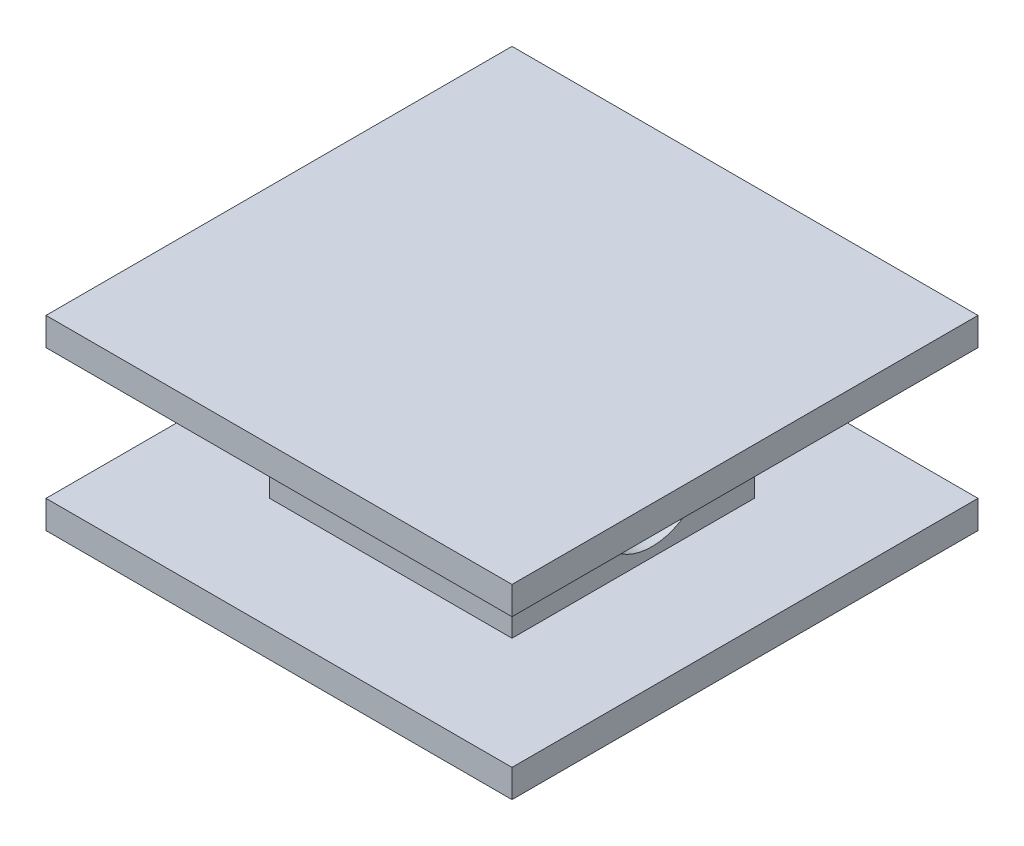
ISO-10303-21;
HEADER;
FILE_DESCRIPTION(('STEP AP214'),'2;1');
FILE_NAME('part.step','',(''),(''),'','','');
FILE_SCHEMA(('AUTOMOTIVE_DESIGN { 1 0 10303 214 1 1 1 1 }'));
ENDSEC;
DATA;
#1=APPLICATION_CONTEXT('core data for automotive mechanical design processes');
#2=APPLICATION_PROTOCOL_DEFINITION('international standard','automotive_design',2000,#1);
#3=PRODUCT_CONTEXT('',#1,'mechanical');
#4=PRODUCT('Part','Part','',(#3));
#5=PRODUCT_RELATED_PRODUCT_CATEGORY('part','',(#4));
#6=PRODUCT_DEFINITION_FORMATION('','',#4);
#7=PRODUCT_DEFINITION_CONTEXT('part definition',#1,'design');
#8=PRODUCT_DEFINITION('design','',#6,#7);
#9=PRODUCT_DEFINITION_SHAPE('','',#8);
#10=(LENGTH_UNIT() NAMED_UNIT(*) SI_UNIT(.MILLI.,.METRE.));
#11=(NAMED_UNIT(*) PLANE_ANGLE_UNIT() SI_UNIT($,.RADIAN.));
#12=(NAMED_UNIT(*) SI_UNIT($,.STERADIAN.) SOLID_ANGLE_UNIT());
#13=UNCERTAINTY_MEASURE_WITH_UNIT(LENGTH_MEASURE(1.E-05),#10,'distance_accuracy_value','');
#14=(GEOMETRIC_REPRESENTATION_CONTEXT(3) GLOBAL_UNCERTAINTY_ASSIGNED_CONTEXT((#13)) GLOBAL_UNIT_ASSIGNED_CONTEXT((#10,
#11,#12)) REPRESENTATION_CONTEXT('',''));
#15=CARTESIAN_POINT('',(0.,0.,0.));
#16=DIRECTION('',(0.,0.,1.));
#17=DIRECTION('',(1.,0.,0.));
#18=AXIS2_PLACEMENT_3D('',#15,#16,#17);
#19=CARTESIAN_POINT('',(-6.5,0.,0.));
#20=DIRECTION('',(1.,0.,0.));
#21=DIRECTION('',(0.,0.,-1.));
#22=AXIS2_PLACEMENT_3D('',#19,#20,#21);
#23=PLANE('',#22);
#24=CARTESIAN_POINT('',(-6.5,0.,3.3));
#25=DIRECTION('',(1.,0.,0.));
#26=DIRECTION('',(0.,0.,-1.));
#27=AXIS2_PLACEMENT_3D('',#24,#25,#26);
#28=CIRCLE('',#27,1.25);
#29=CARTESIAN_POINT('',(-6.5,0.85986381999708,2.39273255813953));
#30=VERTEX_POINT('',#29);
#31=CARTESIAN_POINT('',(-6.5,-0.85986381999708,2.39273255813953));
#32=VERTEX_POINT('',#31);
#33=EDGE_CURVE('E142',#30,#32,#28,.T.);
#34=ORIENTED_EDGE('',*,*,#33,.T.);
#35=CARTESIAN_POINT('',(-6.5,0.,-1.));
#36=DIRECTION('',(1.,0.,0.));
#37=DIRECTION('',(0.,0.,-1.));
#38=AXIS2_PLACEMENT_3D('',#35,#36,#37);
#39=CIRCLE('',#38,3.5);
#40=CARTESIAN_POINT('',(-6.5,-3.5,-1.));
#41=VERTEX_POINT('',#40);
#42=EDGE_CURVE('E157',#32,#41,#39,.T.);
#43=ORIENTED_EDGE('',*,*,#42,.T.);
#44=DIRECTION('',(0.,0.,-1.));
#45=VECTOR('',#44,1.);
#46=CARTESIAN_POINT('',(-6.5,-3.5,12.5));
#47=LINE('',#46,#45);
#48=CARTESIAN_POINT('',(-6.5,-3.5,6.50000000000001));
#49=VERTEX_POINT('',#48);
#50=EDGE_CURVE('E281',#49,#41,#47,.T.);
#51=ORIENTED_EDGE('',*,*,#50,.F.);
#52=DIRECTION('',(0.,-1.,0.));
#53=VECTOR('',#52,1.);
#54=CARTESIAN_POINT('',(-6.5,0.,6.50000000000001));
#55=LINE('',#54,#53);
#56=CARTESIAN_POINT('',(-6.5,3.5,6.50000000000001));
#57=VERTEX_POINT('',#56);
#58=EDGE_CURVE('E282',#57,#49,#55,.T.);
#59=ORIENTED_EDGE('',*,*,#58,.F.);
#60=DIRECTION('',(0.,0.,1.));
#61=VECTOR('',#60,1.);
#62=CARTESIAN_POINT('',(-6.5,3.5,12.5));
#63=LINE('',#62,#61);
#64=CARTESIAN_POINT('',(-6.5,3.5,-1.));
#65=VERTEX_POINT('',#64);
#66=EDGE_CURVE('E154',#65,#57,#63,.T.);
#67=ORIENTED_EDGE('',*,*,#66,.F.);
#68=EDGE_CURVE('E56',#65,#30,#39,.T.);
#69=ORIENTED_EDGE('',*,*,#68,.T.);
#70=EDGE_LOOP('',(#34,#43,#51,#59,#67,#69));
#71=FACE_BOUND('',#70,.T.);
#72=ADVANCED_FACE('F35',(#71),#23,.F.);
#73=CARTESIAN_POINT('',(3.5,0.,-1.));
#74=DIRECTION('',(-1.,0.,0.));
#75=DIRECTION('',(0.,0.,1.));
#76=AXIS2_PLACEMENT_3D('',#73,#74,#75);
#77=CYLINDRICAL_SURFACE('',#76,3.5);
#78=CARTESIAN_POINT('',(3.5,0.,-1.));
#79=DIRECTION('',(1.,0.,0.));
#80=DIRECTION('',(0.,0.,-1.));
#81=AXIS2_PLACEMENT_3D('',#78,#79,#80);
#82=CIRCLE('',#81,3.5);
#83=CARTESIAN_POINT('',(3.5,0.,-4.5));
#84=VERTEX_POINT('',#83);
#85=EDGE_CURVE('E156',#84,#84,#82,.T.);
#86=ORIENTED_EDGE('',*,*,#85,.T.);
#87=EDGE_LOOP('',(#86));
#88=FACE_BOUND('',#87,.T.);
#89=CARTESIAN_POINT('',(-0.500000000000002,0.,-1.));
#90=DIRECTION('',(1.,0.,0.));
#91=DIRECTION('',(0.,0.,-1.));
#92=AXIS2_PLACEMENT_3D('',#89,#90,#91);
#93=CIRCLE('',#92,3.5);
#94=CARTESIAN_POINT('',(-0.500000000000002,0.85986381999708,2.39273255813953));
#95=VERTEX_POINT('',#94);
#96=CARTESIAN_POINT('',(-0.500000000000002,-0.85986381999708,2.39273255813953));
#97=VERTEX_POINT('',#96);
#98=EDGE_CURVE('E151',#95,#97,#93,.T.);
#99=ORIENTED_EDGE('',*,*,#98,.F.);
#100=DIRECTION('',(-1.,0.,0.));
#101=VECTOR('',#100,1.);
#102=CARTESIAN_POINT('',(-3.5,0.85986381999708,2.39273255813953));
#103=LINE('',#102,#101);
#104=EDGE_CURVE('E11',#95,#30,#103,.T.);
#105=ORIENTED_EDGE('',*,*,#104,.T.);
#106=ORIENTED_EDGE('',*,*,#68,.F.);
#107=EDGE_CURVE('E159',#41,#65,#39,.T.);
#108=ORIENTED_EDGE('',*,*,#107,.F.);
#109=ORIENTED_EDGE('',*,*,#42,.F.);
#110=DIRECTION('',(-1.,0.,0.));
#111=VECTOR('',#110,1.);
#112=CARTESIAN_POINT('',(-3.5,-0.85986381999708,2.39273255813953));
#113=LINE('',#112,#111);
#114=EDGE_CURVE('E43',#32,#97,#113,.F.);
#115=ORIENTED_EDGE('',*,*,#114,.T.);
#116=EDGE_LOOP('',(#99,#105,#106,#108,#109,#115));
#117=FACE_BOUND('',#116,.T.);
#118=ADVANCED_FACE('F150',(#88,#117),#77,.F.);
#119=ORIENTED_EDGE('',*,*,#107,.T.);
#120=CARTESIAN_POINT('',(-6.5,3.5,-6.50000000000001));
#121=VERTEX_POINT('',#120);
#122=EDGE_CURVE('E261',#121,#65,#63,.T.);
#123=ORIENTED_EDGE('',*,*,#122,.F.);
#124=DIRECTION('',(0.,1.,0.));
#125=VECTOR('',#124,1.);
#126=CARTESIAN_POINT('',(-6.5,0.,-6.50000000000001));
#127=LINE('',#126,#125);
#128=CARTESIAN_POINT('',(-6.5,-3.5,-6.50000000000001));
#129=VERTEX_POINT('',#128);
#130=EDGE_CURVE('E351',#129,#121,#127,.T.);
#131=ORIENTED_EDGE('',*,*,#130,.F.);
#132=EDGE_CURVE('E285',#41,#129,#47,.T.);
#133=ORIENTED_EDGE('',*,*,#132,.F.);
#134=EDGE_LOOP('',(#119,#123,#131,#133));
#135=FACE_BOUND('',#134,.T.);
#136=ADVANCED_FACE('F186',(#135),#23,.F.);
#137=CARTESIAN_POINT('',(6.5,0.,0.));
#138=DIRECTION('',(-1.,0.,0.));
#139=DIRECTION('',(0.,0.,-1.));
#140=AXIS2_PLACEMENT_3D('',#137,#138,#139);
#141=PLANE('',#140);
#142=CARTESIAN_POINT('',(6.5,0.,-1.));
#143=DIRECTION('',(-1.,0.,0.));
#144=DIRECTION('',(0.,0.,1.));
#145=AXIS2_PLACEMENT_3D('',#142,#143,#144);
#146=CIRCLE('',#145,3.);
#147=CARTESIAN_POINT('',(6.5,0.,2.));
#148=VERTEX_POINT('',#147);
#149=EDGE_CURVE('E148',#148,#148,#146,.T.);
#150=ORIENTED_EDGE('',*,*,#149,.T.);
#151=EDGE_LOOP('',(#150));
#152=FACE_BOUND('',#151,.T.);
#153=DIRECTION('',(0.,-1.,0.));
#154=VECTOR('',#153,1.);
#155=CARTESIAN_POINT('',(6.5,0.,-6.50000000000001));
#156=LINE('',#155,#154);
#157=CARTESIAN_POINT('',(6.5,3.5,-6.50000000000001));
#158=VERTEX_POINT('',#157);
#159=CARTESIAN_POINT('',(6.5,-3.5,-6.50000000000001));
#160=VERTEX_POINT('',#159);
#161=EDGE_CURVE('E353',#158,#160,#156,.T.);
#162=ORIENTED_EDGE('',*,*,#161,.F.);
#163=DIRECTION('',(0.,0.,1.));
#164=VECTOR('',#163,1.);
#165=CARTESIAN_POINT('',(6.5,3.5,12.5));
#166=LINE('',#165,#164);
#167=CARTESIAN_POINT('',(6.5,3.5,6.50000000000001));
#168=VERTEX_POINT('',#167);
#169=EDGE_CURVE('E340',#158,#168,#166,.T.);
#170=ORIENTED_EDGE('',*,*,#169,.T.);
#171=DIRECTION('',(0.,1.,0.));
#172=VECTOR('',#171,1.);
#173=CARTESIAN_POINT('',(6.5,0.,6.50000000000001));
#174=LINE('',#173,#172);
#175=CARTESIAN_POINT('',(6.5,-3.5,6.50000000000001));
#176=VERTEX_POINT('',#175);
#177=EDGE_CURVE('E276',#176,#168,#174,.T.);
#178=ORIENTED_EDGE('',*,*,#177,.F.);
#179=DIRECTION('',(0.,0.,-1.));
#180=VECTOR('',#179,1.);
#181=CARTESIAN_POINT('',(6.5,-3.5,12.5));
#182=LINE('',#181,#180);
#183=EDGE_CURVE('E295',#176,#160,#182,.T.);
#184=ORIENTED_EDGE('',*,*,#183,.T.);
#185=EDGE_LOOP('',(#162,#170,#178,#184));
#186=FACE_BOUND('',#185,.T.);
#187=ADVANCED_FACE('F192',(#152,#186),#141,.F.);
#188=CARTESIAN_POINT('',(-12.5,5.,-12.5));
#189=DIRECTION('',(0.,0.,1.));
#190=DIRECTION('',(1.,0.,0.));
#191=AXIS2_PLACEMENT_3D('',#188,#189,#190);
#192=PLANE('',#191);
#193=DIRECTION('',(-1.,0.,0.));
#194=VECTOR('',#193,1.);
#195=CARTESIAN_POINT('',(-6.5,-3.5,-12.5));
#196=LINE('',#195,#194);
#197=CARTESIAN_POINT('',(12.5,-3.5,-12.5));
#198=VERTEX_POINT('',#197);
#199=CARTESIAN_POINT('',(-12.5,-3.5,-12.5));
#200=VERTEX_POINT('',#199);
#201=EDGE_CURVE('E299',#198,#200,#196,.T.);
#202=ORIENTED_EDGE('',*,*,#201,.F.);
#203=DIRECTION('',(0.,-1.,0.));
#204=VECTOR('',#203,1.);
#205=CARTESIAN_POINT('',(12.5,5.,-12.5));
#206=LINE('',#205,#204);
#207=CARTESIAN_POINT('',(12.5,-5.,-12.5));
#208=VERTEX_POINT('',#207);
#209=EDGE_CURVE('E327',#198,#208,#206,.T.);
#210=ORIENTED_EDGE('',*,*,#209,.T.);
#211=DIRECTION('',(-1.,0.,0.));
#212=VECTOR('',#211,1.);
#213=CARTESIAN_POINT('',(-12.5,-5.,-12.5));
#214=LINE('',#213,#212);
#215=CARTESIAN_POINT('',(-12.5,-5.,-12.5));
#216=VERTEX_POINT('',#215);
#217=EDGE_CURVE('E314',#208,#216,#214,.T.);
#218=ORIENTED_EDGE('',*,*,#217,.T.);
#219=DIRECTION('',(0.,-1.,0.));
#220=VECTOR('',#219,1.);
#221=CARTESIAN_POINT('',(-12.5,5.,-12.5));
#222=LINE('',#221,#220);
#223=EDGE_CURVE('E324',#200,#216,#222,.T.);
#224=ORIENTED_EDGE('',*,*,#223,.F.);
#225=EDGE_LOOP('',(#202,#210,#218,#224));
#226=FACE_BOUND('',#225,.T.);
#227=ADVANCED_FACE('F205',(#226),#192,.F.);
#228=CARTESIAN_POINT('',(12.5,5.,-12.5));
#229=VERTEX_POINT('',#228);
#230=CARTESIAN_POINT('',(12.5,3.5,-12.5));
#231=VERTEX_POINT('',#230);
#232=EDGE_CURVE('E272',#229,#231,#206,.T.);
#233=ORIENTED_EDGE('',*,*,#232,.T.);
#234=DIRECTION('',(-1.,0.,0.));
#235=VECTOR('',#234,1.);
#236=CARTESIAN_POINT('',(-6.5,3.5,-12.5));
#237=LINE('',#236,#235);
#238=CARTESIAN_POINT('',(-12.5,3.5,-12.5));
#239=VERTEX_POINT('',#238);
#240=EDGE_CURVE('E260',#231,#239,#237,.T.);
#241=ORIENTED_EDGE('',*,*,#240,.T.);
#242=CARTESIAN_POINT('',(-12.5,5.,-12.5));
#243=VERTEX_POINT('',#242);
#244=EDGE_CURVE('E325',#243,#239,#222,.T.);
#245=ORIENTED_EDGE('',*,*,#244,.F.);
#246=DIRECTION('',(-1.,0.,0.));
#247=VECTOR('',#246,1.);
#248=CARTESIAN_POINT('',(-12.5,5.,-12.5));
#249=LINE('',#248,#247);
#250=EDGE_CURVE('E323',#229,#243,#249,.T.);
#251=ORIENTED_EDGE('',*,*,#250,.F.);
#252=EDGE_LOOP('',(#233,#241,#245,#251));
#253=FACE_BOUND('',#252,.T.);
#254=ADVANCED_FACE('F226',(#253),#192,.F.);
#255=CARTESIAN_POINT('',(-12.5,5.,12.5));
#256=DIRECTION('',(0.,0.,-1.));
#257=DIRECTION('',(-1.,0.,0.));
#258=AXIS2_PLACEMENT_3D('',#255,#256,#257);
#259=PLANE('',#258);
#260=DIRECTION('',(-1.,0.,0.));
#261=VECTOR('',#260,1.);
#262=CARTESIAN_POINT('',(-6.5,3.5,12.5));
#263=LINE('',#262,#261);
#264=CARTESIAN_POINT('',(12.5,3.5,12.5));
#265=VERTEX_POINT('',#264);
#266=CARTESIAN_POINT('',(-12.5,3.5,12.5));
#267=VERTEX_POINT('',#266);
#268=EDGE_CURVE('E253',#265,#267,#263,.T.);
#269=ORIENTED_EDGE('',*,*,#268,.F.);
#270=DIRECTION('',(0.,-1.,0.));
#271=VECTOR('',#270,1.);
#272=CARTESIAN_POINT('',(12.5,5.,12.5));
#273=LINE('',#272,#271);
#274=CARTESIAN_POINT('',(12.5,5.,12.5));
#275=VERTEX_POINT('',#274);
#276=EDGE_CURVE('E255',#275,#265,#273,.T.);
#277=ORIENTED_EDGE('',*,*,#276,.F.);
#278=DIRECTION('',(1.,0.,0.));
#279=VECTOR('',#278,1.);
#280=CARTESIAN_POINT('',(-12.5,5.,12.5));
#281=LINE('',#280,#279);
#282=CARTESIAN_POINT('',(-12.5,5.,12.5));
#283=VERTEX_POINT('',#282);
#284=EDGE_CURVE('E320',#283,#275,#281,.T.);
#285=ORIENTED_EDGE('',*,*,#284,.F.);
#286=DIRECTION('',(0.,-1.,0.));
#287=VECTOR('',#286,1.);
#288=CARTESIAN_POINT('',(-12.5,5.,12.5));
#289=LINE('',#288,#287);
#290=EDGE_CURVE('E258',#283,#267,#289,.T.);
#291=ORIENTED_EDGE('',*,*,#290,.T.);
#292=EDGE_LOOP('',(#269,#277,#285,#291));
#293=FACE_BOUND('',#292,.T.);
#294=ADVANCED_FACE('F235',(#293),#259,.F.);
#295=CARTESIAN_POINT('',(12.5,5.,12.5));
#296=DIRECTION('',(-1.,0.,0.));
#297=DIRECTION('',(0.,0.,1.));
#298=AXIS2_PLACEMENT_3D('',#295,#296,#297);
#299=PLANE('',#298);
#300=ORIENTED_EDGE('',*,*,#276,.T.);
#301=DIRECTION('',(0.,0.,1.));
#302=VECTOR('',#301,1.);
#303=CARTESIAN_POINT('',(12.5,3.5,12.5));
#304=LINE('',#303,#302);
#305=EDGE_CURVE('E265',#231,#265,#304,.T.);
#306=ORIENTED_EDGE('',*,*,#305,.F.);
#307=ORIENTED_EDGE('',*,*,#232,.F.);
#308=DIRECTION('',(0.,0.,-1.));
#309=VECTOR('',#308,1.);
#310=CARTESIAN_POINT('',(12.5,5.,12.5));
#311=LINE('',#310,#309);
#312=EDGE_CURVE('E267',#275,#229,#311,.T.);
#313=ORIENTED_EDGE('',*,*,#312,.F.);
#314=EDGE_LOOP('',(#300,#306,#307,#313));
#315=FACE_BOUND('',#314,.T.);
#316=ADVANCED_FACE('F231',(#315),#299,.F.);
#317=CARTESIAN_POINT('',(-12.5,5.,12.5));
#318=DIRECTION('',(1.,0.,0.));
#319=DIRECTION('',(0.,0.,-1.));
#320=AXIS2_PLACEMENT_3D('',#317,#318,#319);
#321=PLANE('',#320);
#322=DIRECTION('',(0.,0.,-1.));
#323=VECTOR('',#322,1.);
#324=CARTESIAN_POINT('',(-12.5,-3.5,12.5));
#325=LINE('',#324,#323);
#326=CARTESIAN_POINT('',(-12.5,-3.5,12.5));
#327=VERTEX_POINT('',#326);
#328=EDGE_CURVE('E293',#327,#200,#325,.T.);
#329=ORIENTED_EDGE('',*,*,#328,.T.);
#330=ORIENTED_EDGE('',*,*,#223,.T.);
#331=DIRECTION('',(0.,0.,1.));
#332=VECTOR('',#331,1.);
#333=CARTESIAN_POINT('',(-12.5,-5.,12.5));
#334=LINE('',#333,#332);
#335=CARTESIAN_POINT('',(-12.5,-5.,12.5));
#336=VERTEX_POINT('',#335);
#337=EDGE_CURVE('E305',#216,#336,#334,.T.);
#338=ORIENTED_EDGE('',*,*,#337,.T.);
#339=EDGE_CURVE('E268',#327,#336,#289,.T.);
#340=ORIENTED_EDGE('',*,*,#339,.F.);
#341=EDGE_LOOP('',(#329,#330,#338,#340));
#342=FACE_BOUND('',#341,.T.);
#343=ADVANCED_FACE('F37',(#342),#321,.F.);
#344=DIRECTION('',(0.,0.,1.));
#345=VECTOR('',#344,1.);
#346=CARTESIAN_POINT('',(-12.5,3.5,12.5));
#347=LINE('',#346,#345);
#348=EDGE_CURVE('E288',#239,#267,#347,.T.);
#349=ORIENTED_EDGE('',*,*,#348,.T.);
#350=ORIENTED_EDGE('',*,*,#290,.F.);
#351=DIRECTION('',(0.,0.,1.));
#352=VECTOR('',#351,1.);
#353=CARTESIAN_POINT('',(-12.5,5.,12.5));
#354=LINE('',#353,#352);
#355=EDGE_CURVE('E317',#243,#283,#354,.T.);
#356=ORIENTED_EDGE('',*,*,#355,.F.);
#357=ORIENTED_EDGE('',*,*,#244,.T.);
#358=EDGE_LOOP('',(#349,#350,#356,#357));
#359=FACE_BOUND('',#358,.T.);
#360=ADVANCED_FACE('F233',(#359),#321,.F.);
#361=CARTESIAN_POINT('',(12.5,-3.5,12.5));
#362=VERTEX_POINT('',#361);
#363=CARTESIAN_POINT('',(12.5,-5.,12.5));
#364=VERTEX_POINT('',#363);
#365=EDGE_CURVE('E269',#362,#364,#273,.T.);
#366=ORIENTED_EDGE('',*,*,#365,.F.);
#367=DIRECTION('',(-1.,0.,0.));
#368=VECTOR('',#367,1.);
#369=CARTESIAN_POINT('',(-6.5,-3.5,12.5));
#370=LINE('',#369,#368);
#371=EDGE_CURVE('E302',#362,#327,#370,.T.);
#372=ORIENTED_EDGE('',*,*,#371,.T.);
#373=ORIENTED_EDGE('',*,*,#339,.T.);
#374=DIRECTION('',(1.,0.,0.));
#375=VECTOR('',#374,1.);
#376=CARTESIAN_POINT('',(-12.5,-5.,12.5));
#377=LINE('',#376,#375);
#378=EDGE_CURVE('E308',#336,#364,#377,.T.);
#379=ORIENTED_EDGE('',*,*,#378,.T.);
#380=EDGE_LOOP('',(#366,#372,#373,#379));
#381=FACE_BOUND('',#380,.T.);
#382=ADVANCED_FACE('F229',(#381),#259,.F.);
#383=ORIENTED_EDGE('',*,*,#209,.F.);
#384=DIRECTION('',(0.,0.,-1.));
#385=VECTOR('',#384,1.);
#386=CARTESIAN_POINT('',(12.5,-3.5,12.5));
#387=LINE('',#386,#385);
#388=EDGE_CURVE('E290',#362,#198,#387,.T.);
#389=ORIENTED_EDGE('',*,*,#388,.F.);
#390=ORIENTED_EDGE('',*,*,#365,.T.);
#391=DIRECTION('',(0.,0.,-1.));
#392=VECTOR('',#391,1.);
#393=CARTESIAN_POINT('',(12.5,-5.,12.5));
#394=LINE('',#393,#392);
#395=EDGE_CURVE('E311',#364,#208,#394,.T.);
#396=ORIENTED_EDGE('',*,*,#395,.T.);
#397=EDGE_LOOP('',(#383,#389,#390,#396));
#398=FACE_BOUND('',#397,.T.);
#399=ADVANCED_FACE('F222',(#398),#299,.F.);
#400=CARTESIAN_POINT('',(-12.5,5.,12.5));
#401=DIRECTION('',(0.,-1.,0.));
#402=DIRECTION('',(0.,0.,-1.));
#403=AXIS2_PLACEMENT_3D('',#400,#401,#402);
#404=PLANE('',#403);
#405=ORIENTED_EDGE('',*,*,#355,.T.);
#406=ORIENTED_EDGE('',*,*,#284,.T.);
#407=ORIENTED_EDGE('',*,*,#312,.T.);
#408=ORIENTED_EDGE('',*,*,#250,.T.);
#409=EDGE_LOOP('',(#405,#406,#407,#408));
#410=FACE_BOUND('',#409,.T.);
#411=ADVANCED_FACE('F218',(#410),#404,.F.);
#412=CARTESIAN_POINT('',(-12.5,-5.,12.5));
#413=DIRECTION('',(0.,-1.,0.));
#414=DIRECTION('',(0.,0.,-1.));
#415=AXIS2_PLACEMENT_3D('',#412,#413,#414);
#416=PLANE('',#415);
#417=ORIENTED_EDGE('',*,*,#337,.F.);
#418=ORIENTED_EDGE('',*,*,#217,.F.);
#419=ORIENTED_EDGE('',*,*,#395,.F.);
#420=ORIENTED_EDGE('',*,*,#378,.F.);
#421=EDGE_LOOP('',(#417,#418,#419,#420));
#422=FACE_BOUND('',#421,.T.);
#423=ADVANCED_FACE('F214',(#422),#416,.T.);
#424=CARTESIAN_POINT('',(-6.5,-3.5,12.5));
#425=DIRECTION('',(0.,1.,0.));
#426=DIRECTION('',(0.,0.,1.));
#427=AXIS2_PLACEMENT_3D('',#424,#425,#426);
#428=PLANE('',#427);
#429=ORIENTED_EDGE('',*,*,#388,.T.);
#430=ORIENTED_EDGE('',*,*,#201,.T.);
#431=ORIENTED_EDGE('',*,*,#328,.F.);
#432=ORIENTED_EDGE('',*,*,#371,.F.);
#433=EDGE_LOOP('',(#429,#430,#431,#432));
#434=FACE_BOUND('',#433,.T.);
#435=ORIENTED_EDGE('',*,*,#50,.T.);
#436=ORIENTED_EDGE('',*,*,#132,.T.);
#437=DIRECTION('',(1.,0.,0.));
#438=VECTOR('',#437,1.);
#439=CARTESIAN_POINT('',(-12.5,-3.5,-6.50000000000001));
#440=LINE('',#439,#438);
#441=EDGE_CURVE('E355',#129,#160,#440,.T.);
#442=ORIENTED_EDGE('',*,*,#441,.T.);
#443=ORIENTED_EDGE('',*,*,#183,.F.);
#444=DIRECTION('',(1.,0.,0.));
#445=VECTOR('',#444,1.);
#446=CARTESIAN_POINT('',(-12.5,-3.5,6.50000000000001));
#447=LINE('',#446,#445);
#448=EDGE_CURVE('E349',#49,#176,#447,.T.);
#449=ORIENTED_EDGE('',*,*,#448,.F.);
#450=EDGE_LOOP('',(#435,#436,#442,#443,#449));
#451=FACE_BOUND('',#450,.T.);
#452=ADVANCED_FACE('F210',(#434,#451),#428,.T.);
#453=CARTESIAN_POINT('',(-6.5,3.5,12.5));
#454=DIRECTION('',(0.,-1.,0.));
#455=DIRECTION('',(0.,0.,-1.));
#456=AXIS2_PLACEMENT_3D('',#453,#454,#455);
#457=PLANE('',#456);
#458=DIRECTION('',(-1.,0.,0.));
#459=VECTOR('',#458,1.);
#460=CARTESIAN_POINT('',(-12.5,3.5,-6.50000000000001));
#461=LINE('',#460,#459);
#462=EDGE_CURVE('E161',#158,#121,#461,.T.);
#463=ORIENTED_EDGE('',*,*,#462,.T.);
#464=ORIENTED_EDGE('',*,*,#122,.T.);
#465=ORIENTED_EDGE('',*,*,#66,.T.);
#466=DIRECTION('',(-1.,0.,0.));
#467=VECTOR('',#466,1.);
#468=CARTESIAN_POINT('',(-12.5,3.5,6.50000000000001));
#469=LINE('',#468,#467);
#470=EDGE_CURVE('E342',#168,#57,#469,.T.);
#471=ORIENTED_EDGE('',*,*,#470,.F.);
#472=ORIENTED_EDGE('',*,*,#169,.F.);
#473=EDGE_LOOP('',(#463,#464,#465,#471,#472));
#474=FACE_BOUND('',#473,.T.);
#475=ORIENTED_EDGE('',*,*,#305,.T.);
#476=ORIENTED_EDGE('',*,*,#268,.T.);
#477=ORIENTED_EDGE('',*,*,#348,.F.);
#478=ORIENTED_EDGE('',*,*,#240,.F.);
#479=EDGE_LOOP('',(#475,#476,#477,#478));
#480=FACE_BOUND('',#479,.T.);
#481=ADVANCED_FACE('F202',(#474,#480),#457,.T.);
#482=CARTESIAN_POINT('',(0.,0.,6.50000000000001));
#483=DIRECTION('',(0.,0.,1.));
#484=DIRECTION('',(1.,0.,0.));
#485=AXIS2_PLACEMENT_3D('',#482,#483,#484);
#486=PLANE('',#485);
#487=ORIENTED_EDGE('',*,*,#58,.T.);
#488=ORIENTED_EDGE('',*,*,#448,.T.);
#489=ORIENTED_EDGE('',*,*,#177,.T.);
#490=ORIENTED_EDGE('',*,*,#470,.T.);
#491=EDGE_LOOP('',(#487,#488,#489,#490));
#492=FACE_BOUND('',#491,.T.);
#493=ADVANCED_FACE('F198',(#492),#486,.T.);
#494=CARTESIAN_POINT('',(0.,0.,-6.50000000000001));
#495=DIRECTION('',(0.,0.,-1.));
#496=DIRECTION('',(1.,0.,0.));
#497=AXIS2_PLACEMENT_3D('',#494,#495,#496);
#498=PLANE('',#497);
#499=ORIENTED_EDGE('',*,*,#130,.T.);
#500=ORIENTED_EDGE('',*,*,#462,.F.);
#501=ORIENTED_EDGE('',*,*,#161,.T.);
#502=ORIENTED_EDGE('',*,*,#441,.F.);
#503=EDGE_LOOP('',(#499,#500,#501,#502));
#504=FACE_BOUND('',#503,.T.);
#505=ADVANCED_FACE('F181',(#504),#498,.T.);
#506=CARTESIAN_POINT('',(3.5,0.,-1.));
#507=DIRECTION('',(1.,0.,0.));
#508=DIRECTION('',(0.,0.,-1.));
#509=AXIS2_PLACEMENT_3D('',#506,#507,#508);
#510=PLANE('',#509);
#511=CARTESIAN_POINT('',(3.5,0.,-1.));
#512=DIRECTION('',(-1.,0.,0.));
#513=DIRECTION('',(0.,0.,1.));
#514=AXIS2_PLACEMENT_3D('',#511,#512,#513);
#515=CIRCLE('',#514,3.);
#516=CARTESIAN_POINT('',(3.5,0.,2.));
#517=VERTEX_POINT('',#516);
#518=EDGE_CURVE('E171',#517,#517,#515,.T.);
#519=ORIENTED_EDGE('',*,*,#518,.F.);
#520=EDGE_LOOP('',(#519));
#521=FACE_BOUND('',#520,.T.);
#522=ORIENTED_EDGE('',*,*,#85,.F.);
#523=EDGE_LOOP('',(#522));
#524=FACE_BOUND('',#523,.T.);
#525=ADVANCED_FACE('F178',(#521,#524),#510,.F.);
#526=CARTESIAN_POINT('',(-0.500000000000002,0.,3.3));
#527=DIRECTION('',(-1.,0.,0.));
#528=DIRECTION('',(0.,0.,1.));
#529=AXIS2_PLACEMENT_3D('',#526,#527,#528);
#530=CYLINDRICAL_SURFACE('',#529,1.25);
#531=CARTESIAN_POINT('',(-0.500000000000002,0.,3.3));
#532=DIRECTION('',(1.,0.,0.));
#533=DIRECTION('',(0.,0.,-1.));
#534=AXIS2_PLACEMENT_3D('',#531,#532,#533);
#535=CIRCLE('',#534,1.25);
#536=EDGE_CURVE('E49',#95,#97,#535,.T.);
#537=ORIENTED_EDGE('',*,*,#536,.T.);
#538=ORIENTED_EDGE('',*,*,#114,.F.);
#539=ORIENTED_EDGE('',*,*,#33,.F.);
#540=ORIENTED_EDGE('',*,*,#104,.F.);
#541=EDGE_LOOP('',(#537,#538,#539,#540));
#542=FACE_BOUND('',#541,.T.);
#543=ADVANCED_FACE('F143',(#542),#530,.F.);
#544=CARTESIAN_POINT('',(-0.500000000000002,0.,3.3));
#545=DIRECTION('',(1.,0.,0.));
#546=DIRECTION('',(0.,0.,-1.));
#547=AXIS2_PLACEMENT_3D('',#544,#545,#546);
#548=PLANE('',#547);
#549=ORIENTED_EDGE('',*,*,#98,.T.);
#550=ORIENTED_EDGE('',*,*,#536,.F.);
#551=EDGE_LOOP('',(#549,#550));
#552=FACE_BOUND('',#551,.T.);
#553=ADVANCED_FACE('F431',(#552),#548,.F.);
#554=CARTESIAN_POINT('',(12.5,0.,-1.));
#555=DIRECTION('',(-1.,0.,0.));
#556=DIRECTION('',(0.,0.,1.));
#557=AXIS2_PLACEMENT_3D('',#554,#555,#556);
#558=CYLINDRICAL_SURFACE('',#557,3.);
#559=ORIENTED_EDGE('',*,*,#518,.T.);
#560=EDGE_LOOP('',(#559));
#561=FACE_BOUND('',#560,.T.);
#562=ORIENTED_EDGE('',*,*,#149,.F.);
#563=EDGE_LOOP('',(#562));
#564=FACE_BOUND('',#563,.T.);
#565=ADVANCED_FACE('F175',(#561,#564),#558,.F.);
#566=CLOSED_SHELL('',(#72,#118,#136,#187,#227,#254,#294,#316,#343,#360,#382,#399,#411,#423,#452,
#481,#493,#505,#525,#543,#553,#565));
#567=MANIFOLD_SOLID_BREP('B2',#566);
#568=ADVANCED_BREP_SHAPE_REPRESENTATION('',(#18,#567),#14);
#569=SHAPE_DEFINITION_REPRESENTATION(#9,#568);
ENDSEC;
END-ISO-10303-21;
